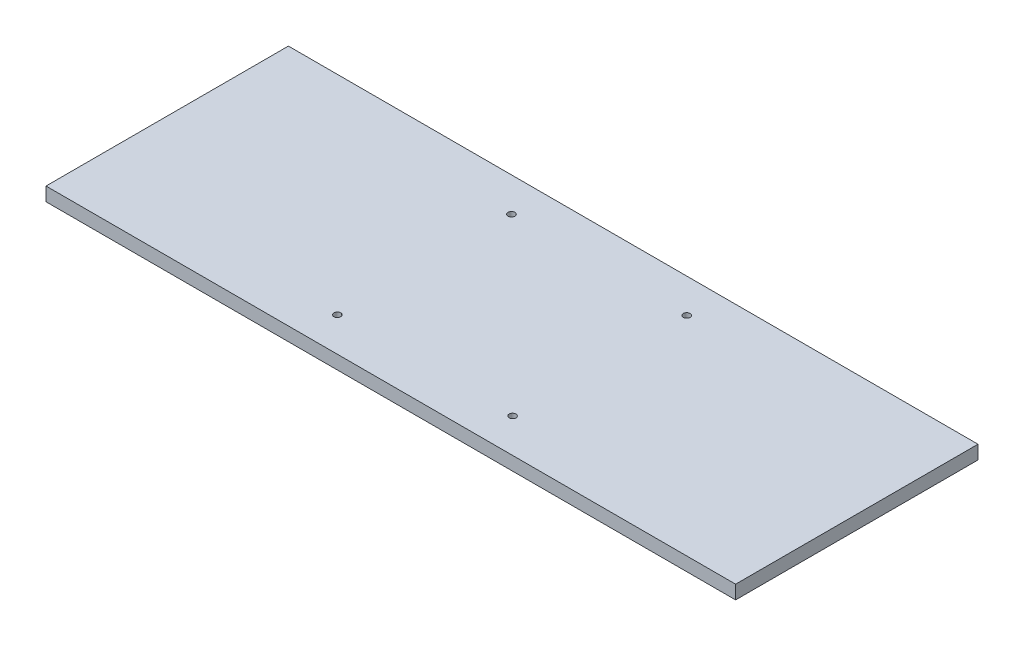
ISO-10303-21;
HEADER;
FILE_DESCRIPTION(('STEP AP214'),'2;1');
FILE_NAME('part.step','',(''),(''),'','','');
FILE_SCHEMA(('AUTOMOTIVE_DESIGN { 1 0 10303 214 1 1 1 1 }'));
ENDSEC;
DATA;
#1=APPLICATION_CONTEXT('core data for automotive mechanical design processes');
#2=APPLICATION_PROTOCOL_DEFINITION('international standard','automotive_design',2000,#1);
#3=PRODUCT_CONTEXT('',#1,'mechanical');
#4=PRODUCT('Part','Part','',(#3));
#5=PRODUCT_RELATED_PRODUCT_CATEGORY('part','',(#4));
#6=PRODUCT_DEFINITION_FORMATION('','',#4);
#7=PRODUCT_DEFINITION_CONTEXT('part definition',#1,'design');
#8=PRODUCT_DEFINITION('design','',#6,#7);
#9=PRODUCT_DEFINITION_SHAPE('','',#8);
#10=(LENGTH_UNIT() NAMED_UNIT(*) SI_UNIT(.MILLI.,.METRE.));
#11=(NAMED_UNIT(*) PLANE_ANGLE_UNIT() SI_UNIT($,.RADIAN.));
#12=(NAMED_UNIT(*) SI_UNIT($,.STERADIAN.) SOLID_ANGLE_UNIT());
#13=UNCERTAINTY_MEASURE_WITH_UNIT(LENGTH_MEASURE(1.E-05),#10,'distance_accuracy_value','');
#14=(GEOMETRIC_REPRESENTATION_CONTEXT(3) GLOBAL_UNCERTAINTY_ASSIGNED_CONTEXT((#13)) GLOBAL_UNIT_ASSIGNED_CONTEXT((#10,
#11,#12)) REPRESENTATION_CONTEXT('',''));
#15=CARTESIAN_POINT('',(0.,0.,0.));
#16=DIRECTION('',(0.,0.,1.));
#17=DIRECTION('',(1.,0.,0.));
#18=AXIS2_PLACEMENT_3D('',#15,#16,#17);
#19=CARTESIAN_POINT('',(0.,8.,0.));
#20=DIRECTION('',(0.,-1.,0.));
#21=DIRECTION('',(0.,0.,-1.));
#22=AXIS2_PLACEMENT_3D('',#19,#20,#21);
#23=PLANE('',#22);
#24=DIRECTION('',(0.,0.,1.));
#25=VECTOR('',#24,1.);
#26=CARTESIAN_POINT('',(0.,8.,0.));
#27=LINE('',#26,#25);
#28=CARTESIAN_POINT('',(0.,8.,-142.));
#29=VERTEX_POINT('',#28);
#30=CARTESIAN_POINT('',(0.,8.,0.));
#31=VERTEX_POINT('',#30);
#32=EDGE_CURVE('E91',#29,#31,#27,.T.);
#33=ORIENTED_EDGE('',*,*,#32,.T.);
#34=DIRECTION('',(1.,0.,0.));
#35=VECTOR('',#34,1.);
#36=CARTESIAN_POINT('',(0.,8.,0.));
#37=LINE('',#36,#35);
#38=CARTESIAN_POINT('',(404.,8.,0.));
#39=VERTEX_POINT('',#38);
#40=EDGE_CURVE('E86',#31,#39,#37,.T.);
#41=ORIENTED_EDGE('',*,*,#40,.T.);
#42=DIRECTION('',(0.,0.,-1.));
#43=VECTOR('',#42,1.);
#44=CARTESIAN_POINT('',(404.,8.,0.));
#45=LINE('',#44,#43);
#46=CARTESIAN_POINT('',(404.,8.,-142.));
#47=VERTEX_POINT('',#46);
#48=EDGE_CURVE('E89',#39,#47,#45,.T.);
#49=ORIENTED_EDGE('',*,*,#48,.T.);
#50=DIRECTION('',(-1.,0.,0.));
#51=VECTOR('',#50,1.);
#52=CARTESIAN_POINT('',(0.,8.,-142.));
#53=LINE('',#52,#51);
#54=EDGE_CURVE('E56',#47,#29,#53,.T.);
#55=ORIENTED_EDGE('',*,*,#54,.T.);
#56=EDGE_LOOP('',(#33,#41,#49,#55));
#57=FACE_BOUND('',#56,.T.);
#58=CARTESIAN_POINT('',(150.666666666667,8.,-19.9999999999998));
#59=DIRECTION('',(0.,1.,0.));
#60=DIRECTION('',(0.,0.,1.));
#61=AXIS2_PLACEMENT_3D('',#58,#59,#60);
#62=CIRCLE('',#61,2.00000000000008);
#63=CARTESIAN_POINT('',(150.666666666667,8.,-17.9999999999998));
#64=VERTEX_POINT('',#63);
#65=EDGE_CURVE('E106',#64,#64,#62,.T.);
#66=ORIENTED_EDGE('',*,*,#65,.F.);
#67=EDGE_LOOP('',(#66));
#68=FACE_BOUND('',#67,.T.);
#69=CARTESIAN_POINT('',(253.333333333333,8.,-19.9999999999998));
#70=DIRECTION('',(0.,1.,0.));
#71=DIRECTION('',(0.,0.,1.));
#72=AXIS2_PLACEMENT_3D('',#69,#70,#71);
#73=CIRCLE('',#72,2.00000000000011);
#74=CARTESIAN_POINT('',(253.333333333333,8.,-17.9999999999997));
#75=VERTEX_POINT('',#74);
#76=EDGE_CURVE('E121',#75,#75,#73,.T.);
#77=ORIENTED_EDGE('',*,*,#76,.F.);
#78=EDGE_LOOP('',(#77));
#79=FACE_BOUND('',#78,.T.);
#80=CARTESIAN_POINT('',(253.333333333333,8.,-122.));
#81=DIRECTION('',(0.,1.,0.));
#82=DIRECTION('',(0.,0.,1.));
#83=AXIS2_PLACEMENT_3D('',#80,#81,#82);
#84=CIRCLE('',#83,2.00000000000011);
#85=CARTESIAN_POINT('',(253.333333333333,8.,-120.));
#86=VERTEX_POINT('',#85);
#87=EDGE_CURVE('E127',#86,#86,#84,.T.);
#88=ORIENTED_EDGE('',*,*,#87,.F.);
#89=EDGE_LOOP('',(#88));
#90=FACE_BOUND('',#89,.T.);
#91=CARTESIAN_POINT('',(150.666666666667,8.,-122.));
#92=DIRECTION('',(0.,1.,0.));
#93=DIRECTION('',(0.,0.,1.));
#94=AXIS2_PLACEMENT_3D('',#91,#92,#93);
#95=CIRCLE('',#94,2.00000000000008);
#96=CARTESIAN_POINT('',(150.666666666667,8.,-120.));
#97=VERTEX_POINT('',#96);
#98=EDGE_CURVE('E133',#97,#97,#95,.T.);
#99=ORIENTED_EDGE('',*,*,#98,.F.);
#100=EDGE_LOOP('',(#99));
#101=FACE_BOUND('',#100,.T.);
#102=ADVANCED_FACE('F39',(#57,#68,#79,#90,#101),#23,.F.);
#103=CARTESIAN_POINT('',(0.,0.,0.));
#104=DIRECTION('',(0.,-1.,0.));
#105=DIRECTION('',(0.,0.,-1.));
#106=AXIS2_PLACEMENT_3D('',#103,#104,#105);
#107=PLANE('',#106);
#108=CARTESIAN_POINT('',(253.333333333333,0.,-122.));
#109=DIRECTION('',(0.,1.,0.));
#110=DIRECTION('',(0.,0.,1.));
#111=AXIS2_PLACEMENT_3D('',#108,#109,#110);
#112=CIRCLE('',#111,2.00000000000011);
#113=CARTESIAN_POINT('',(253.333333333333,0.,-120.));
#114=VERTEX_POINT('',#113);
#115=EDGE_CURVE('E130',#114,#114,#112,.T.);
#116=ORIENTED_EDGE('',*,*,#115,.T.);
#117=EDGE_LOOP('',(#116));
#118=FACE_BOUND('',#117,.T.);
#119=CARTESIAN_POINT('',(150.666666666667,0.,-19.9999999999998));
#120=DIRECTION('',(0.,1.,0.));
#121=DIRECTION('',(0.,0.,1.));
#122=AXIS2_PLACEMENT_3D('',#119,#120,#121);
#123=CIRCLE('',#122,2.00000000000008);
#124=CARTESIAN_POINT('',(150.666666666667,0.,-17.9999999999998));
#125=VERTEX_POINT('',#124);
#126=EDGE_CURVE('E118',#125,#125,#123,.T.);
#127=ORIENTED_EDGE('',*,*,#126,.T.);
#128=EDGE_LOOP('',(#127));
#129=FACE_BOUND('',#128,.T.);
#130=DIRECTION('',(0.,0.,1.));
#131=VECTOR('',#130,1.);
#132=CARTESIAN_POINT('',(0.,0.,0.));
#133=LINE('',#132,#131);
#134=CARTESIAN_POINT('',(0.,0.,-142.));
#135=VERTEX_POINT('',#134);
#136=CARTESIAN_POINT('',(0.,0.,0.));
#137=VERTEX_POINT('',#136);
#138=EDGE_CURVE('E103',#135,#137,#133,.T.);
#139=ORIENTED_EDGE('',*,*,#138,.F.);
#140=DIRECTION('',(-1.,0.,0.));
#141=VECTOR('',#140,1.);
#142=CARTESIAN_POINT('',(0.,0.,-142.));
#143=LINE('',#142,#141);
#144=CARTESIAN_POINT('',(404.,0.,-142.));
#145=VERTEX_POINT('',#144);
#146=EDGE_CURVE('E79',#145,#135,#143,.T.);
#147=ORIENTED_EDGE('',*,*,#146,.F.);
#148=DIRECTION('',(0.,0.,-1.));
#149=VECTOR('',#148,1.);
#150=CARTESIAN_POINT('',(404.,0.,0.));
#151=LINE('',#150,#149);
#152=CARTESIAN_POINT('',(404.,0.,0.));
#153=VERTEX_POINT('',#152);
#154=EDGE_CURVE('E73',#153,#145,#151,.T.);
#155=ORIENTED_EDGE('',*,*,#154,.F.);
#156=DIRECTION('',(1.,0.,0.));
#157=VECTOR('',#156,1.);
#158=CARTESIAN_POINT('',(0.,0.,0.));
#159=LINE('',#158,#157);
#160=EDGE_CURVE('E95',#137,#153,#159,.T.);
#161=ORIENTED_EDGE('',*,*,#160,.F.);
#162=EDGE_LOOP('',(#139,#147,#155,#161));
#163=FACE_BOUND('',#162,.T.);
#164=CARTESIAN_POINT('',(253.333333333333,0.,-19.9999999999998));
#165=DIRECTION('',(0.,1.,0.));
#166=DIRECTION('',(0.,0.,1.));
#167=AXIS2_PLACEMENT_3D('',#164,#165,#166);
#168=CIRCLE('',#167,2.00000000000011);
#169=CARTESIAN_POINT('',(253.333333333333,0.,-17.9999999999997));
#170=VERTEX_POINT('',#169);
#171=EDGE_CURVE('E124',#170,#170,#168,.T.);
#172=ORIENTED_EDGE('',*,*,#171,.T.);
#173=EDGE_LOOP('',(#172));
#174=FACE_BOUND('',#173,.T.);
#175=CARTESIAN_POINT('',(150.666666666667,0.,-122.));
#176=DIRECTION('',(0.,1.,0.));
#177=DIRECTION('',(0.,0.,1.));
#178=AXIS2_PLACEMENT_3D('',#175,#176,#177);
#179=CIRCLE('',#178,2.00000000000008);
#180=CARTESIAN_POINT('',(150.666666666667,0.,-120.));
#181=VERTEX_POINT('',#180);
#182=EDGE_CURVE('E136',#181,#181,#179,.T.);
#183=ORIENTED_EDGE('',*,*,#182,.T.);
#184=EDGE_LOOP('',(#183));
#185=FACE_BOUND('',#184,.T.);
#186=ADVANCED_FACE('F114',(#118,#129,#163,#174,#185),#107,.T.);
#187=CARTESIAN_POINT('',(0.,8.,0.));
#188=DIRECTION('',(1.,0.,0.));
#189=DIRECTION('',(0.,0.,-1.));
#190=AXIS2_PLACEMENT_3D('',#187,#188,#189);
#191=PLANE('',#190);
#192=ORIENTED_EDGE('',*,*,#138,.T.);
#193=DIRECTION('',(0.,-1.,0.));
#194=VECTOR('',#193,1.);
#195=CARTESIAN_POINT('',(0.,8.,0.));
#196=LINE('',#195,#194);
#197=EDGE_CURVE('E11',#31,#137,#196,.T.);
#198=ORIENTED_EDGE('',*,*,#197,.F.);
#199=ORIENTED_EDGE('',*,*,#32,.F.);
#200=DIRECTION('',(0.,-1.,0.));
#201=VECTOR('',#200,1.);
#202=CARTESIAN_POINT('',(0.,8.,-142.));
#203=LINE('',#202,#201);
#204=EDGE_CURVE('E99',#29,#135,#203,.T.);
#205=ORIENTED_EDGE('',*,*,#204,.T.);
#206=EDGE_LOOP('',(#192,#198,#199,#205));
#207=FACE_BOUND('',#206,.T.);
#208=ADVANCED_FACE('F41',(#207),#191,.F.);
#209=CARTESIAN_POINT('',(0.,8.,0.));
#210=DIRECTION('',(0.,0.,-1.));
#211=DIRECTION('',(-1.,0.,0.));
#212=AXIS2_PLACEMENT_3D('',#209,#210,#211);
#213=PLANE('',#212);
#214=ORIENTED_EDGE('',*,*,#160,.T.);
#215=DIRECTION('',(0.,-1.,0.));
#216=VECTOR('',#215,1.);
#217=CARTESIAN_POINT('',(404.,8.,0.));
#218=LINE('',#217,#216);
#219=EDGE_CURVE('E48',#39,#153,#218,.T.);
#220=ORIENTED_EDGE('',*,*,#219,.F.);
#221=ORIENTED_EDGE('',*,*,#40,.F.);
#222=ORIENTED_EDGE('',*,*,#197,.T.);
#223=EDGE_LOOP('',(#214,#220,#221,#222));
#224=FACE_BOUND('',#223,.T.);
#225=ADVANCED_FACE('F94',(#224),#213,.F.);
#226=CARTESIAN_POINT('',(404.,8.,0.));
#227=DIRECTION('',(-1.,0.,0.));
#228=DIRECTION('',(0.,0.,1.));
#229=AXIS2_PLACEMENT_3D('',#226,#227,#228);
#230=PLANE('',#229);
#231=ORIENTED_EDGE('',*,*,#154,.T.);
#232=DIRECTION('',(0.,-1.,0.));
#233=VECTOR('',#232,1.);
#234=CARTESIAN_POINT('',(404.,8.,-142.));
#235=LINE('',#234,#233);
#236=EDGE_CURVE('E96',#47,#145,#235,.T.);
#237=ORIENTED_EDGE('',*,*,#236,.F.);
#238=ORIENTED_EDGE('',*,*,#48,.F.);
#239=ORIENTED_EDGE('',*,*,#219,.T.);
#240=EDGE_LOOP('',(#231,#237,#238,#239));
#241=FACE_BOUND('',#240,.T.);
#242=ADVANCED_FACE('F97',(#241),#230,.F.);
#243=CARTESIAN_POINT('',(0.,8.,-142.));
#244=DIRECTION('',(0.,0.,1.));
#245=DIRECTION('',(1.,0.,0.));
#246=AXIS2_PLACEMENT_3D('',#243,#244,#245);
#247=PLANE('',#246);
#248=ORIENTED_EDGE('',*,*,#146,.T.);
#249=ORIENTED_EDGE('',*,*,#204,.F.);
#250=ORIENTED_EDGE('',*,*,#54,.F.);
#251=ORIENTED_EDGE('',*,*,#236,.T.);
#252=EDGE_LOOP('',(#248,#249,#250,#251));
#253=FACE_BOUND('',#252,.T.);
#254=ADVANCED_FACE('F111',(#253),#247,.F.);
#255=CARTESIAN_POINT('',(150.666666666667,8.,-19.9999999999998));
#256=DIRECTION('',(0.,-1.,0.));
#257=DIRECTION('',(0.,0.,-1.));
#258=AXIS2_PLACEMENT_3D('',#255,#256,#257);
#259=CYLINDRICAL_SURFACE('',#258,2.00000000000008);
#260=ORIENTED_EDGE('',*,*,#65,.T.);
#261=EDGE_LOOP('',(#260));
#262=FACE_BOUND('',#261,.T.);
#263=ORIENTED_EDGE('',*,*,#126,.F.);
#264=EDGE_LOOP('',(#263));
#265=FACE_BOUND('',#264,.T.);
#266=ADVANCED_FACE('F153',(#262,#265),#259,.F.);
#267=CARTESIAN_POINT('',(253.333333333333,8.,-19.9999999999998));
#268=DIRECTION('',(0.,-1.,0.));
#269=DIRECTION('',(0.,0.,-1.));
#270=AXIS2_PLACEMENT_3D('',#267,#268,#269);
#271=CYLINDRICAL_SURFACE('',#270,2.00000000000011);
#272=ORIENTED_EDGE('',*,*,#76,.T.);
#273=EDGE_LOOP('',(#272));
#274=FACE_BOUND('',#273,.T.);
#275=ORIENTED_EDGE('',*,*,#171,.F.);
#276=EDGE_LOOP('',(#275));
#277=FACE_BOUND('',#276,.T.);
#278=ADVANCED_FACE('F198',(#274,#277),#271,.F.);
#279=CARTESIAN_POINT('',(253.333333333333,8.,-122.));
#280=DIRECTION('',(0.,-1.,0.));
#281=DIRECTION('',(0.,0.,-1.));
#282=AXIS2_PLACEMENT_3D('',#279,#280,#281);
#283=CYLINDRICAL_SURFACE('',#282,2.00000000000011);
#284=ORIENTED_EDGE('',*,*,#87,.T.);
#285=EDGE_LOOP('',(#284));
#286=FACE_BOUND('',#285,.T.);
#287=ORIENTED_EDGE('',*,*,#115,.F.);
#288=EDGE_LOOP('',(#287));
#289=FACE_BOUND('',#288,.T.);
#290=ADVANCED_FACE('F206',(#286,#289),#283,.F.);
#291=CARTESIAN_POINT('',(150.666666666667,8.,-122.));
#292=DIRECTION('',(0.,-1.,0.));
#293=DIRECTION('',(0.,0.,-1.));
#294=AXIS2_PLACEMENT_3D('',#291,#292,#293);
#295=CYLINDRICAL_SURFACE('',#294,2.00000000000008);
#296=ORIENTED_EDGE('',*,*,#98,.T.);
#297=EDGE_LOOP('',(#296));
#298=FACE_BOUND('',#297,.T.);
#299=ORIENTED_EDGE('',*,*,#182,.F.);
#300=EDGE_LOOP('',(#299));
#301=FACE_BOUND('',#300,.T.);
#302=ADVANCED_FACE('F142',(#298,#301),#295,.F.);
#303=CLOSED_SHELL('',(#102,#186,#208,#225,#242,#254,#266,#278,#290,#302));
#304=MANIFOLD_SOLID_BREP('B2',#303);
#305=ADVANCED_BREP_SHAPE_REPRESENTATION('',(#18,#304),#14);
#306=SHAPE_DEFINITION_REPRESENTATION(#9,#305);
ENDSEC;
END-ISO-10303-21;
